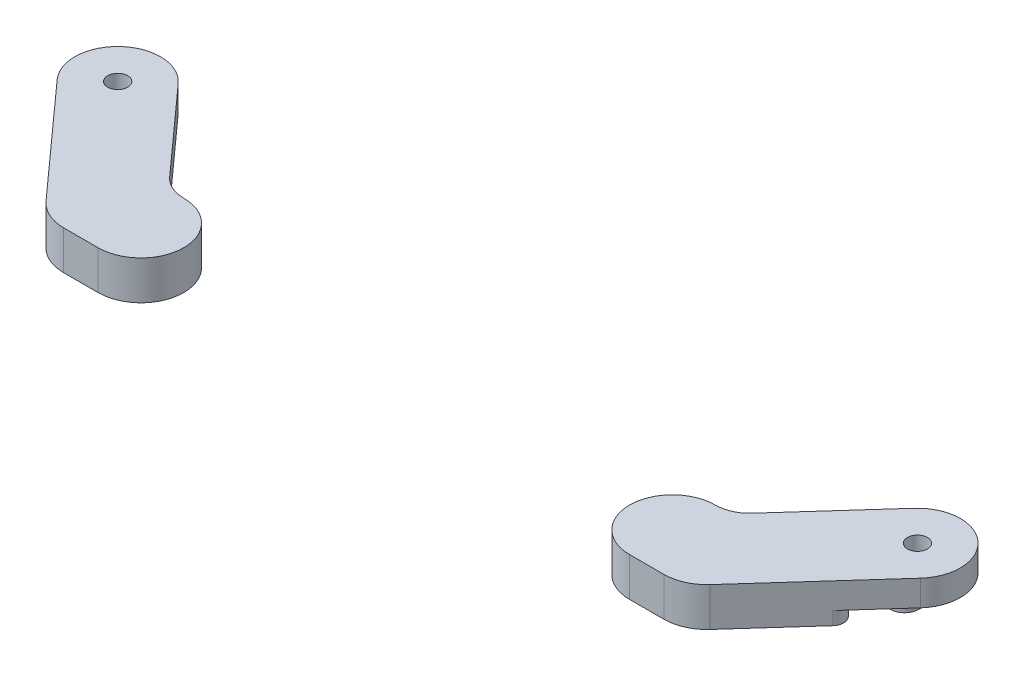
ISO-10303-21;
HEADER;
FILE_DESCRIPTION(('STEP AP214'),'2;1');
FILE_NAME('part.step','',(''),(''),'','','');
FILE_SCHEMA(('AUTOMOTIVE_DESIGN { 1 0 10303 214 1 1 1 1 }'));
ENDSEC;
DATA;
#1=APPLICATION_CONTEXT('core data for automotive mechanical design processes');
#2=APPLICATION_PROTOCOL_DEFINITION('international standard','automotive_design',2000,#1);
#3=PRODUCT_CONTEXT('',#1,'mechanical');
#4=PRODUCT('Part','Part','',(#3));
#5=PRODUCT_RELATED_PRODUCT_CATEGORY('part','',(#4));
#6=PRODUCT_DEFINITION_FORMATION('','',#4);
#7=PRODUCT_DEFINITION_CONTEXT('part definition',#1,'design');
#8=PRODUCT_DEFINITION('design','',#6,#7);
#9=PRODUCT_DEFINITION_SHAPE('','',#8);
#10=(LENGTH_UNIT() NAMED_UNIT(*) SI_UNIT(.MILLI.,.METRE.));
#11=(NAMED_UNIT(*) PLANE_ANGLE_UNIT() SI_UNIT($,.RADIAN.));
#12=(NAMED_UNIT(*) SI_UNIT($,.STERADIAN.) SOLID_ANGLE_UNIT());
#13=UNCERTAINTY_MEASURE_WITH_UNIT(LENGTH_MEASURE(1.E-05),#10,'distance_accuracy_value','');
#14=(GEOMETRIC_REPRESENTATION_CONTEXT(3) GLOBAL_UNCERTAINTY_ASSIGNED_CONTEXT((#13)) GLOBAL_UNIT_ASSIGNED_CONTEXT((#10,
#11,#12)) REPRESENTATION_CONTEXT('',''));
#15=CARTESIAN_POINT('',(0.,0.,0.));
#16=DIRECTION('',(0.,0.,1.));
#17=DIRECTION('',(1.,0.,0.));
#18=AXIS2_PLACEMENT_3D('',#15,#16,#17);
#19=CARTESIAN_POINT('',(92.970606407611,0.,-128.6));
#20=DIRECTION('',(0.,1.,0.));
#21=DIRECTION('',(0.,0.,1.));
#22=AXIS2_PLACEMENT_3D('',#19,#20,#21);
#23=PLANE('',#22);
#24=CARTESIAN_POINT('',(-139.9,0.,-135.9));
#25=DIRECTION('',(0.,-1.,0.));
#26=DIRECTION('',(0.,0.,-1.));
#27=AXIS2_PLACEMENT_3D('',#24,#25,#26);
#28=CIRCLE('',#27,5.00000000000003);
#29=CARTESIAN_POINT('',(-134.9,0.,-135.9));
#30=VERTEX_POINT('',#29);
#31=CARTESIAN_POINT('',(-144.9,0.,-135.9));
#32=VERTEX_POINT('',#31);
#33=EDGE_CURVE('E212',#30,#32,#28,.T.);
#34=ORIENTED_EDGE('',*,*,#33,.F.);
#35=DIRECTION('',(0.,0.,1.));
#36=VECTOR('',#35,1.);
#37=CARTESIAN_POINT('',(-134.9,0.,-135.9));
#38=LINE('',#37,#36);
#39=CARTESIAN_POINT('',(-134.9,0.,-144.9));
#40=VERTEX_POINT('',#39);
#41=EDGE_CURVE('E217',#40,#30,#38,.T.);
#42=ORIENTED_EDGE('',*,*,#41,.F.);
#43=CARTESIAN_POINT('',(-139.9,0.,-144.9));
#44=DIRECTION('',(0.,-1.,0.));
#45=DIRECTION('',(0.,0.,-1.));
#46=AXIS2_PLACEMENT_3D('',#43,#44,#45);
#47=CIRCLE('',#46,5.00000000000003);
#48=CARTESIAN_POINT('',(-144.9,0.,-144.9));
#49=VERTEX_POINT('',#48);
#50=EDGE_CURVE('E229',#49,#40,#47,.T.);
#51=ORIENTED_EDGE('',*,*,#50,.F.);
#52=DIRECTION('',(0.,0.,-1.));
#53=VECTOR('',#52,1.);
#54=CARTESIAN_POINT('',(-144.9,0.,-135.9));
#55=LINE('',#54,#53);
#56=EDGE_CURVE('E226',#32,#49,#55,.T.);
#57=ORIENTED_EDGE('',*,*,#56,.F.);
#58=EDGE_LOOP('',(#34,#42,#51,#57));
#59=FACE_BOUND('',#58,.T.);
#60=CARTESIAN_POINT('',(-133.557307355128,0.,-116.9));
#61=DIRECTION('',(0.,-1.,0.));
#62=DIRECTION('',(0.,0.,1.));
#63=AXIS2_PLACEMENT_3D('',#60,#61,#62);
#64=CIRCLE('',#63,4.);
#65=CARTESIAN_POINT('',(-136.531246063845,0.,-114.224988120252));
#66=VERTEX_POINT('',#65);
#67=CARTESIAN_POINT('',(-133.557307355128,0.,-120.9));
#68=VERTEX_POINT('',#67);
#69=EDGE_CURVE('E197',#66,#68,#64,.T.);
#70=ORIENTED_EDGE('',*,*,#69,.F.);
#71=DIRECTION('',(0.668752969937039,0.,0.743484677179287));
#72=VECTOR('',#71,1.);
#73=CARTESIAN_POINT('',(-151.052270157689,0.,-130.368705450944));
#74=LINE('',#73,#72);
#75=CARTESIAN_POINT('',(-151.052270157689,0.,-130.368705450944));
#76=VERTEX_POINT('',#75);
#77=EDGE_CURVE('E255',#76,#66,#74,.T.);
#78=ORIENTED_EDGE('',*,*,#77,.F.);
#79=CARTESIAN_POINT('',(-139.9,0.,-140.4));
#80=DIRECTION('',(0.,1.,0.));
#81=DIRECTION('',(0.,0.,1.));
#82=AXIS2_PLACEMENT_3D('',#79,#80,#81);
#83=CIRCLE('',#82,15.);
#84=CARTESIAN_POINT('',(-128.747729842311,0.,-150.431294549056));
#85=VERTEX_POINT('',#84);
#86=EDGE_CURVE('E251',#85,#76,#83,.T.);
#87=ORIENTED_EDGE('',*,*,#86,.F.);
#88=DIRECTION('',(-0.66875296993704,0.,-0.743484677179287));
#89=VECTOR('',#88,1.);
#90=CARTESIAN_POINT('',(-128.747729842311,0.,-150.431294549056));
#91=LINE('',#90,#89);
#92=CARTESIAN_POINT('',(-101.892422533762,0.,-120.574964360756));
#93=VERTEX_POINT('',#92);
#94=EDGE_CURVE('E246',#93,#85,#91,.T.);
#95=ORIENTED_EDGE('',*,*,#94,.F.);
#96=CARTESIAN_POINT('',(-92.970606407611,0.,-128.6));
#97=DIRECTION('',(0.,-1.,0.));
#98=DIRECTION('',(0.,0.,-1.));
#99=AXIS2_PLACEMENT_3D('',#96,#97,#98);
#100=CIRCLE('',#99,12.);
#101=CARTESIAN_POINT('',(-101.155921001443,0.,-119.825));
#102=VERTEX_POINT('',#101);
#103=EDGE_CURVE('E247',#102,#93,#100,.T.);
#104=ORIENTED_EDGE('',*,*,#103,.F.);
#105=CARTESIAN_POINT('',(-103.884359199387,0.,-116.9));
#106=DIRECTION('',(0.,-1.,0.));
#107=DIRECTION('',(0.,0.,-1.));
#108=AXIS2_PLACEMENT_3D('',#105,#106,#107);
#109=CIRCLE('',#108,4.);
#110=CARTESIAN_POINT('',(-103.884359199387,0.,-120.9));
#111=VERTEX_POINT('',#110);
#112=EDGE_CURVE('E72',#111,#102,#109,.T.);
#113=ORIENTED_EDGE('',*,*,#112,.F.);
#114=DIRECTION('',(1.,0.,0.));
#115=VECTOR('',#114,1.);
#116=CARTESIAN_POINT('',(-133.557307355128,0.,-120.9));
#117=LINE('',#116,#115);
#118=EDGE_CURVE('E67',#68,#111,#117,.T.);
#119=ORIENTED_EDGE('',*,*,#118,.F.);
#120=EDGE_LOOP('',(#70,#78,#87,#95,#104,#113,#119));
#121=FACE_BOUND('',#120,.T.);
#122=ADVANCED_FACE('F51',(#59,#121),#23,.F.);
#123=CARTESIAN_POINT('',(105.,9.,-86.6000000000001));
#124=DIRECTION('',(0.,0.,-1.));
#125=DIRECTION('',(-1.,0.,0.));
#126=AXIS2_PLACEMENT_3D('',#123,#124,#125);
#127=PLANE('',#126);
#128=DIRECTION('',(0.,1.,0.));
#129=VECTOR('',#128,1.);
#130=CARTESIAN_POINT('',(-92.970606407611,0.,-86.6000000000001));
#131=LINE('',#130,#129);
#132=CARTESIAN_POINT('',(-92.970606407611,-4.6,-86.6000000000001));
#133=VERTEX_POINT('',#132);
#134=CARTESIAN_POINT('',(-92.970606407611,9.,-86.6000000000001));
#135=VERTEX_POINT('',#134);
#136=EDGE_CURVE('E156',#133,#135,#131,.T.);
#137=ORIENTED_EDGE('',*,*,#136,.T.);
#138=DIRECTION('',(1.,0.,0.));
#139=VECTOR('',#138,1.);
#140=CARTESIAN_POINT('',(105.,9.,-86.6000000000001));
#141=LINE('',#140,#139);
#142=CARTESIAN_POINT('',(-105.,9.,-86.6000000000001));
#143=VERTEX_POINT('',#142);
#144=EDGE_CURVE('E55',#143,#135,#141,.T.);
#145=ORIENTED_EDGE('',*,*,#144,.F.);
#146=DIRECTION('',(0.,-1.,0.));
#147=VECTOR('',#146,1.);
#148=CARTESIAN_POINT('',(-105.,9.,-86.6000000000001));
#149=LINE('',#148,#147);
#150=CARTESIAN_POINT('',(-105.,-4.6,-86.6000000000001));
#151=VERTEX_POINT('',#150);
#152=EDGE_CURVE('E165',#143,#151,#149,.T.);
#153=ORIENTED_EDGE('',*,*,#152,.T.);
#154=DIRECTION('',(-1.,0.,0.));
#155=VECTOR('',#154,1.);
#156=CARTESIAN_POINT('',(-92.970606407611,-4.6,-86.6000000000001));
#157=LINE('',#156,#155);
#158=EDGE_CURVE('E169',#133,#151,#157,.T.);
#159=ORIENTED_EDGE('',*,*,#158,.F.);
#160=EDGE_LOOP('',(#137,#145,#153,#159));
#161=FACE_BOUND('',#160,.T.);
#162=ADVANCED_FACE('F53',(#161),#127,.F.);
#163=CARTESIAN_POINT('',(92.970606407611,9.,-128.6));
#164=DIRECTION('',(0.,1.,0.));
#165=DIRECTION('',(0.,0.,1.));
#166=AXIS2_PLACEMENT_3D('',#163,#164,#165);
#167=PLANE('',#166);
#168=CARTESIAN_POINT('',(-139.9,9.,-140.4));
#169=DIRECTION('',(0.,1.,0.));
#170=DIRECTION('',(0.,0.,1.));
#171=AXIS2_PLACEMENT_3D('',#168,#169,#170);
#172=CIRCLE('',#171,3.49999999999999);
#173=CARTESIAN_POINT('',(-139.9,9.,-136.9));
#174=VERTEX_POINT('',#173);
#175=EDGE_CURVE('E183',#174,#174,#172,.T.);
#176=ORIENTED_EDGE('',*,*,#175,.F.);
#177=EDGE_LOOP('',(#176));
#178=FACE_BOUND('',#177,.T.);
#179=CARTESIAN_POINT('',(-92.970606407611,9.,-101.6));
#180=DIRECTION('',(0.,-1.,0.));
#181=DIRECTION('',(0.,0.,1.));
#182=AXIS2_PLACEMENT_3D('',#179,#180,#181);
#183=CIRCLE('',#182,15.);
#184=CARTESIAN_POINT('',(-92.970606407611,9.,-116.6));
#185=VERTEX_POINT('',#184);
#186=EDGE_CURVE('E12',#185,#135,#183,.T.);
#187=ORIENTED_EDGE('',*,*,#186,.F.);
#188=CARTESIAN_POINT('',(-92.970606407611,9.,-128.6));
#189=DIRECTION('',(0.,-1.,0.));
#190=DIRECTION('',(0.,0.,-1.));
#191=AXIS2_PLACEMENT_3D('',#188,#189,#190);
#192=CIRCLE('',#191,12.);
#193=CARTESIAN_POINT('',(-101.892422533762,9.,-120.574964360756));
#194=VERTEX_POINT('',#193);
#195=EDGE_CURVE('E261',#185,#194,#192,.T.);
#196=ORIENTED_EDGE('',*,*,#195,.T.);
#197=DIRECTION('',(-0.66875296993704,0.,-0.743484677179287));
#198=VECTOR('',#197,1.);
#199=CARTESIAN_POINT('',(-128.747729842311,9.,-150.431294549056));
#200=LINE('',#199,#198);
#201=CARTESIAN_POINT('',(-128.747729842311,9.,-150.431294549056));
#202=VERTEX_POINT('',#201);
#203=EDGE_CURVE('E273',#194,#202,#200,.T.);
#204=ORIENTED_EDGE('',*,*,#203,.T.);
#205=CARTESIAN_POINT('',(-139.9,9.,-140.4));
#206=DIRECTION('',(0.,1.,0.));
#207=DIRECTION('',(0.,0.,1.));
#208=AXIS2_PLACEMENT_3D('',#205,#206,#207);
#209=CIRCLE('',#208,15.);
#210=CARTESIAN_POINT('',(-151.052270157689,9.,-130.368705450944));
#211=VERTEX_POINT('',#210);
#212=EDGE_CURVE('E271',#202,#211,#209,.T.);
#213=ORIENTED_EDGE('',*,*,#212,.T.);
#214=DIRECTION('',(0.668752969937039,0.,0.743484677179287));
#215=VECTOR('',#214,1.);
#216=CARTESIAN_POINT('',(-151.052270157689,9.,-130.368705450944));
#217=LINE('',#216,#215);
#218=CARTESIAN_POINT('',(-116.152270157689,9.,-91.5687054509445));
#219=VERTEX_POINT('',#218);
#220=EDGE_CURVE('E269',#211,#219,#217,.T.);
#221=ORIENTED_EDGE('',*,*,#220,.T.);
#222=CARTESIAN_POINT('',(-105.,9.,-101.6));
#223=DIRECTION('',(0.,1.,0.));
#224=DIRECTION('',(0.,0.,1.));
#225=AXIS2_PLACEMENT_3D('',#222,#223,#224);
#226=CIRCLE('',#225,15.);
#227=EDGE_CURVE('E267',#219,#143,#226,.T.);
#228=ORIENTED_EDGE('',*,*,#227,.T.);
#229=ORIENTED_EDGE('',*,*,#144,.T.);
#230=EDGE_LOOP('',(#187,#196,#204,#213,#221,#228,#229));
#231=FACE_BOUND('',#230,.T.);
#232=ADVANCED_FACE('F278',(#178,#231),#167,.T.);
#233=CARTESIAN_POINT('',(-92.970606407611,9.,-128.6));
#234=DIRECTION('',(0.,-1.,0.));
#235=DIRECTION('',(0.,0.,-1.));
#236=AXIS2_PLACEMENT_3D('',#233,#234,#235);
#237=CYLINDRICAL_SURFACE('',#236,12.);
#238=DIRECTION('',(0.,-1.,0.));
#239=VECTOR('',#238,1.);
#240=CARTESIAN_POINT('',(-92.970606407611,9.,-116.6));
#241=LINE('',#240,#239);
#242=CARTESIAN_POINT('',(-92.970606407611,-4.6,-116.6));
#243=VERTEX_POINT('',#242);
#244=EDGE_CURVE('E244',#185,#243,#241,.T.);
#245=ORIENTED_EDGE('',*,*,#244,.T.);
#246=CARTESIAN_POINT('',(-92.970606407611,-4.6,-128.6));
#247=DIRECTION('',(0.,1.,0.));
#248=DIRECTION('',(0.,0.,-1.));
#249=AXIS2_PLACEMENT_3D('',#246,#247,#248);
#250=CIRCLE('',#249,12.);
#251=CARTESIAN_POINT('',(-101.155921001443,-4.6,-119.825));
#252=VERTEX_POINT('',#251);
#253=EDGE_CURVE('E179',#252,#243,#250,.T.);
#254=ORIENTED_EDGE('',*,*,#253,.F.);
#255=DIRECTION('',(0.,1.,0.));
#256=VECTOR('',#255,1.);
#257=CARTESIAN_POINT('',(-101.155921001443,-4.6,-119.825));
#258=LINE('',#257,#256);
#259=EDGE_CURVE('E196',#252,#102,#258,.T.);
#260=ORIENTED_EDGE('',*,*,#259,.T.);
#261=ORIENTED_EDGE('',*,*,#103,.T.);
#262=DIRECTION('',(0.,-1.,0.));
#263=VECTOR('',#262,1.);
#264=CARTESIAN_POINT('',(-101.892422533762,9.,-120.574964360756));
#265=LINE('',#264,#263);
#266=EDGE_CURVE('E248',#194,#93,#265,.T.);
#267=ORIENTED_EDGE('',*,*,#266,.F.);
#268=ORIENTED_EDGE('',*,*,#195,.F.);
#269=EDGE_LOOP('',(#245,#254,#260,#261,#267,#268));
#270=FACE_BOUND('',#269,.T.);
#271=ADVANCED_FACE('F282',(#270),#237,.F.);
#272=CARTESIAN_POINT('',(-128.747729842311,9.,-150.431294549056));
#273=DIRECTION('',(-0.743484677179287,0.,0.66875296993704));
#274=DIRECTION('',(0.66875296993704,0.,0.743484677179287));
#275=AXIS2_PLACEMENT_3D('',#272,#273,#274);
#276=PLANE('',#275);
#277=ORIENTED_EDGE('',*,*,#94,.T.);
#278=DIRECTION('',(0.,-1.,0.));
#279=VECTOR('',#278,1.);
#280=CARTESIAN_POINT('',(-128.747729842311,9.,-150.431294549056));
#281=LINE('',#280,#279);
#282=EDGE_CURVE('E252',#202,#85,#281,.T.);
#283=ORIENTED_EDGE('',*,*,#282,.F.);
#284=ORIENTED_EDGE('',*,*,#203,.F.);
#285=ORIENTED_EDGE('',*,*,#266,.T.);
#286=EDGE_LOOP('',(#277,#283,#284,#285));
#287=FACE_BOUND('',#286,.T.);
#288=ADVANCED_FACE('F285',(#287),#276,.F.);
#289=CARTESIAN_POINT('',(-139.9,9.,-140.4));
#290=DIRECTION('',(0.,-1.,0.));
#291=DIRECTION('',(0.,0.,-1.));
#292=AXIS2_PLACEMENT_3D('',#289,#290,#291);
#293=CYLINDRICAL_SURFACE('',#292,15.);
#294=ORIENTED_EDGE('',*,*,#86,.T.);
#295=DIRECTION('',(0.,-1.,0.));
#296=VECTOR('',#295,1.);
#297=CARTESIAN_POINT('',(-151.052270157689,9.,-130.368705450944));
#298=LINE('',#297,#296);
#299=EDGE_CURVE('E256',#211,#76,#298,.T.);
#300=ORIENTED_EDGE('',*,*,#299,.F.);
#301=ORIENTED_EDGE('',*,*,#212,.F.);
#302=ORIENTED_EDGE('',*,*,#282,.T.);
#303=EDGE_LOOP('',(#294,#300,#301,#302));
#304=FACE_BOUND('',#303,.T.);
#305=ADVANCED_FACE('F290',(#304),#293,.T.);
#306=CARTESIAN_POINT('',(-151.052270157689,9.,-130.368705450944));
#307=DIRECTION('',(0.743484677179287,0.,-0.668752969937039));
#308=DIRECTION('',(-0.668752969937039,0.,-0.743484677179287));
#309=AXIS2_PLACEMENT_3D('',#306,#307,#308);
#310=PLANE('',#309);
#311=ORIENTED_EDGE('',*,*,#77,.T.);
#312=DIRECTION('',(0.,1.,0.));
#313=VECTOR('',#312,1.);
#314=CARTESIAN_POINT('',(-136.531246063845,-4.6,-114.224988120252));
#315=LINE('',#314,#313);
#316=CARTESIAN_POINT('',(-136.531246063845,-4.6,-114.224988120252));
#317=VERTEX_POINT('',#316);
#318=EDGE_CURVE('E209',#317,#66,#315,.T.);
#319=ORIENTED_EDGE('',*,*,#318,.F.);
#320=DIRECTION('',(-0.668752969937039,0.,-0.743484677179287));
#321=VECTOR('',#320,1.);
#322=CARTESIAN_POINT('',(-116.152270157689,-4.6,-91.5687054509445));
#323=LINE('',#322,#321);
#324=CARTESIAN_POINT('',(-116.152270157689,-4.6,-91.5687054509445));
#325=VERTEX_POINT('',#324);
#326=EDGE_CURVE('E187',#325,#317,#323,.T.);
#327=ORIENTED_EDGE('',*,*,#326,.F.);
#328=DIRECTION('',(0.,-1.,0.));
#329=VECTOR('',#328,1.);
#330=CARTESIAN_POINT('',(-116.152270157689,9.,-91.5687054509445));
#331=LINE('',#330,#329);
#332=EDGE_CURVE('E60',#219,#325,#331,.T.);
#333=ORIENTED_EDGE('',*,*,#332,.F.);
#334=ORIENTED_EDGE('',*,*,#220,.F.);
#335=ORIENTED_EDGE('',*,*,#299,.T.);
#336=EDGE_LOOP('',(#311,#319,#327,#333,#334,#335));
#337=FACE_BOUND('',#336,.T.);
#338=ADVANCED_FACE('F296',(#337),#310,.F.);
#339=CARTESIAN_POINT('',(-105.,9.,-101.6));
#340=DIRECTION('',(0.,-1.,0.));
#341=DIRECTION('',(0.,0.,-1.));
#342=AXIS2_PLACEMENT_3D('',#339,#340,#341);
#343=CYLINDRICAL_SURFACE('',#342,15.);
#344=ORIENTED_EDGE('',*,*,#332,.T.);
#345=CARTESIAN_POINT('',(-105.,-4.6,-101.6));
#346=DIRECTION('',(0.,-1.,0.));
#347=DIRECTION('',(0.,0.,-1.));
#348=AXIS2_PLACEMENT_3D('',#345,#346,#347);
#349=CIRCLE('',#348,15.);
#350=EDGE_CURVE('E174',#151,#325,#349,.T.);
#351=ORIENTED_EDGE('',*,*,#350,.F.);
#352=ORIENTED_EDGE('',*,*,#152,.F.);
#353=ORIENTED_EDGE('',*,*,#227,.F.);
#354=EDGE_LOOP('',(#344,#351,#352,#353));
#355=FACE_BOUND('',#354,.T.);
#356=ADVANCED_FACE('F299',(#355),#343,.T.);
#357=CARTESIAN_POINT('',(-92.970606407611,0.,-101.6));
#358=DIRECTION('',(0.,1.,0.));
#359=DIRECTION('',(0.,0.,1.));
#360=AXIS2_PLACEMENT_3D('',#357,#358,#359);
#361=CYLINDRICAL_SURFACE('',#360,15.);
#362=ORIENTED_EDGE('',*,*,#186,.T.);
#363=ORIENTED_EDGE('',*,*,#136,.F.);
#364=CARTESIAN_POINT('',(-92.970606407611,-4.6,-101.6));
#365=DIRECTION('',(0.,-1.,0.));
#366=DIRECTION('',(0.,0.,-1.));
#367=AXIS2_PLACEMENT_3D('',#364,#365,#366);
#368=CIRCLE('',#367,15.);
#369=EDGE_CURVE('E160',#243,#133,#368,.T.);
#370=ORIENTED_EDGE('',*,*,#369,.F.);
#371=ORIENTED_EDGE('',*,*,#244,.F.);
#372=EDGE_LOOP('',(#362,#363,#370,#371));
#373=FACE_BOUND('',#372,.T.);
#374=ADVANCED_FACE('F158',(#373),#361,.T.);
#375=CARTESIAN_POINT('',(-139.9,-6.3,-135.9));
#376=DIRECTION('',(0.,1.,0.));
#377=DIRECTION('',(0.,0.,1.));
#378=AXIS2_PLACEMENT_3D('',#375,#376,#377);
#379=CYLINDRICAL_SURFACE('',#378,5.00000000000003);
#380=ORIENTED_EDGE('',*,*,#33,.T.);
#381=DIRECTION('',(0.,1.,0.));
#382=VECTOR('',#381,1.);
#383=CARTESIAN_POINT('',(-144.9,-6.3,-135.9));
#384=LINE('',#383,#382);
#385=CARTESIAN_POINT('',(-144.9,-6.3,-135.9));
#386=VERTEX_POINT('',#385);
#387=EDGE_CURVE('E166',#386,#32,#384,.T.);
#388=ORIENTED_EDGE('',*,*,#387,.F.);
#389=CARTESIAN_POINT('',(-139.9,-6.3,-135.9));
#390=DIRECTION('',(0.,-1.,0.));
#391=DIRECTION('',(0.,0.,-1.));
#392=AXIS2_PLACEMENT_3D('',#389,#390,#391);
#393=CIRCLE('',#392,5.00000000000003);
#394=CARTESIAN_POINT('',(-134.9,-6.3,-135.9));
#395=VERTEX_POINT('',#394);
#396=EDGE_CURVE('E213',#395,#386,#393,.T.);
#397=ORIENTED_EDGE('',*,*,#396,.F.);
#398=DIRECTION('',(0.,1.,0.));
#399=VECTOR('',#398,1.);
#400=CARTESIAN_POINT('',(-134.9,-6.3,-135.9));
#401=LINE('',#400,#399);
#402=EDGE_CURVE('E223',#395,#30,#401,.T.);
#403=ORIENTED_EDGE('',*,*,#402,.T.);
#404=EDGE_LOOP('',(#380,#388,#397,#403));
#405=FACE_BOUND('',#404,.T.);
#406=ADVANCED_FACE('F380',(#405),#379,.T.);
#407=CARTESIAN_POINT('',(-144.9,-6.3,-135.9));
#408=DIRECTION('',(1.,0.,0.));
#409=DIRECTION('',(0.,0.,-1.));
#410=AXIS2_PLACEMENT_3D('',#407,#408,#409);
#411=PLANE('',#410);
#412=ORIENTED_EDGE('',*,*,#56,.T.);
#413=DIRECTION('',(0.,1.,0.));
#414=VECTOR('',#413,1.);
#415=CARTESIAN_POINT('',(-144.9,-6.3,-144.9));
#416=LINE('',#415,#414);
#417=CARTESIAN_POINT('',(-144.9,-6.3,-144.9));
#418=VERTEX_POINT('',#417);
#419=EDGE_CURVE('E239',#418,#49,#416,.T.);
#420=ORIENTED_EDGE('',*,*,#419,.F.);
#421=DIRECTION('',(0.,0.,-1.));
#422=VECTOR('',#421,1.);
#423=CARTESIAN_POINT('',(-144.9,-6.3,-135.9));
#424=LINE('',#423,#422);
#425=EDGE_CURVE('E216',#386,#418,#424,.T.);
#426=ORIENTED_EDGE('',*,*,#425,.F.);
#427=ORIENTED_EDGE('',*,*,#387,.T.);
#428=EDGE_LOOP('',(#412,#420,#426,#427));
#429=FACE_BOUND('',#428,.T.);
#430=ADVANCED_FACE('F439',(#429),#411,.F.);
#431=CARTESIAN_POINT('',(-139.9,-6.3,-144.9));
#432=DIRECTION('',(0.,1.,0.));
#433=DIRECTION('',(0.,0.,1.));
#434=AXIS2_PLACEMENT_3D('',#431,#432,#433);
#435=CYLINDRICAL_SURFACE('',#434,5.00000000000003);
#436=ORIENTED_EDGE('',*,*,#50,.T.);
#437=DIRECTION('',(0.,1.,0.));
#438=VECTOR('',#437,1.);
#439=CARTESIAN_POINT('',(-134.9,-6.3,-144.9));
#440=LINE('',#439,#438);
#441=CARTESIAN_POINT('',(-134.9,-6.3,-144.9));
#442=VERTEX_POINT('',#441);
#443=EDGE_CURVE('E236',#442,#40,#440,.T.);
#444=ORIENTED_EDGE('',*,*,#443,.F.);
#445=CARTESIAN_POINT('',(-139.9,-6.3,-144.9));
#446=DIRECTION('',(0.,-1.,0.));
#447=DIRECTION('',(0.,0.,-1.));
#448=AXIS2_PLACEMENT_3D('',#445,#446,#447);
#449=CIRCLE('',#448,5.00000000000003);
#450=EDGE_CURVE('E219',#418,#442,#449,.T.);
#451=ORIENTED_EDGE('',*,*,#450,.F.);
#452=ORIENTED_EDGE('',*,*,#419,.T.);
#453=EDGE_LOOP('',(#436,#444,#451,#452));
#454=FACE_BOUND('',#453,.T.);
#455=ADVANCED_FACE('F431',(#454),#435,.T.);
#456=CARTESIAN_POINT('',(-134.9,-6.3,-135.9));
#457=DIRECTION('',(-1.,0.,0.));
#458=DIRECTION('',(0.,0.,1.));
#459=AXIS2_PLACEMENT_3D('',#456,#457,#458);
#460=PLANE('',#459);
#461=ORIENTED_EDGE('',*,*,#41,.T.);
#462=ORIENTED_EDGE('',*,*,#402,.F.);
#463=DIRECTION('',(0.,0.,1.));
#464=VECTOR('',#463,1.);
#465=CARTESIAN_POINT('',(-134.9,-6.3,-135.9));
#466=LINE('',#465,#464);
#467=EDGE_CURVE('E221',#442,#395,#466,.T.);
#468=ORIENTED_EDGE('',*,*,#467,.F.);
#469=ORIENTED_EDGE('',*,*,#443,.T.);
#470=EDGE_LOOP('',(#461,#462,#468,#469));
#471=FACE_BOUND('',#470,.T.);
#472=ADVANCED_FACE('F423',(#471),#460,.F.);
#473=CARTESIAN_POINT('',(-139.9,-6.3,-135.9));
#474=DIRECTION('',(0.,-1.,0.));
#475=DIRECTION('',(0.,0.,-1.));
#476=AXIS2_PLACEMENT_3D('',#473,#474,#475);
#477=PLANE('',#476);
#478=ORIENTED_EDGE('',*,*,#396,.T.);
#479=ORIENTED_EDGE('',*,*,#425,.T.);
#480=ORIENTED_EDGE('',*,*,#450,.T.);
#481=ORIENTED_EDGE('',*,*,#467,.T.);
#482=EDGE_LOOP('',(#478,#479,#480,#481));
#483=FACE_BOUND('',#482,.T.);
#484=ADVANCED_FACE('F372',(#483),#477,.T.);
#485=CARTESIAN_POINT('',(-133.557307355128,-4.6,-116.9));
#486=DIRECTION('',(0.,1.,0.));
#487=DIRECTION('',(0.,0.,1.));
#488=AXIS2_PLACEMENT_3D('',#485,#486,#487);
#489=CYLINDRICAL_SURFACE('',#488,4.);
#490=ORIENTED_EDGE('',*,*,#69,.T.);
#491=DIRECTION('',(0.,1.,0.));
#492=VECTOR('',#491,1.);
#493=CARTESIAN_POINT('',(-133.557307355128,-4.6,-120.9));
#494=LINE('',#493,#492);
#495=CARTESIAN_POINT('',(-133.557307355128,-4.6,-120.9));
#496=VERTEX_POINT('',#495);
#497=EDGE_CURVE('E206',#496,#68,#494,.T.);
#498=ORIENTED_EDGE('',*,*,#497,.F.);
#499=CARTESIAN_POINT('',(-133.557307355128,-4.6,-116.9));
#500=DIRECTION('',(0.,-1.,0.));
#501=DIRECTION('',(0.,0.,1.));
#502=AXIS2_PLACEMENT_3D('',#499,#500,#501);
#503=CIRCLE('',#502,4.);
#504=EDGE_CURVE('E189',#317,#496,#503,.T.);
#505=ORIENTED_EDGE('',*,*,#504,.F.);
#506=ORIENTED_EDGE('',*,*,#318,.T.);
#507=EDGE_LOOP('',(#490,#498,#505,#506));
#508=FACE_BOUND('',#507,.T.);
#509=ADVANCED_FACE('F304',(#508),#489,.T.);
#510=CARTESIAN_POINT('',(-133.557307355128,-4.6,-120.9));
#511=DIRECTION('',(0.,0.,1.));
#512=DIRECTION('',(1.,0.,0.));
#513=AXIS2_PLACEMENT_3D('',#510,#511,#512);
#514=PLANE('',#513);
#515=ORIENTED_EDGE('',*,*,#118,.T.);
#516=DIRECTION('',(0.,1.,0.));
#517=VECTOR('',#516,1.);
#518=CARTESIAN_POINT('',(-103.884359199387,-4.6,-120.9));
#519=LINE('',#518,#517);
#520=CARTESIAN_POINT('',(-103.884359199387,-4.6,-120.9));
#521=VERTEX_POINT('',#520);
#522=EDGE_CURVE('E203',#521,#111,#519,.T.);
#523=ORIENTED_EDGE('',*,*,#522,.F.);
#524=DIRECTION('',(1.,0.,0.));
#525=VECTOR('',#524,1.);
#526=CARTESIAN_POINT('',(-133.557307355128,-4.6,-120.9));
#527=LINE('',#526,#525);
#528=EDGE_CURVE('E191',#496,#521,#527,.T.);
#529=ORIENTED_EDGE('',*,*,#528,.F.);
#530=ORIENTED_EDGE('',*,*,#497,.T.);
#531=EDGE_LOOP('',(#515,#523,#529,#530));
#532=FACE_BOUND('',#531,.T.);
#533=ADVANCED_FACE('F308',(#532),#514,.F.);
#534=CARTESIAN_POINT('',(-103.884359199387,-4.6,-116.9));
#535=DIRECTION('',(0.,1.,0.));
#536=DIRECTION('',(0.,0.,1.));
#537=AXIS2_PLACEMENT_3D('',#534,#535,#536);
#538=CYLINDRICAL_SURFACE('',#537,4.);
#539=ORIENTED_EDGE('',*,*,#112,.T.);
#540=ORIENTED_EDGE('',*,*,#259,.F.);
#541=CARTESIAN_POINT('',(-103.884359199387,-4.6,-116.9));
#542=DIRECTION('',(0.,-1.,0.));
#543=DIRECTION('',(0.,0.,-1.));
#544=AXIS2_PLACEMENT_3D('',#541,#542,#543);
#545=CIRCLE('',#544,4.);
#546=EDGE_CURVE('E193',#521,#252,#545,.T.);
#547=ORIENTED_EDGE('',*,*,#546,.F.);
#548=ORIENTED_EDGE('',*,*,#522,.T.);
#549=EDGE_LOOP('',(#539,#540,#547,#548));
#550=FACE_BOUND('',#549,.T.);
#551=ADVANCED_FACE('F312',(#550),#538,.T.);
#552=CARTESIAN_POINT('',(-92.970606407611,-4.6,-101.6));
#553=DIRECTION('',(0.,-1.,0.));
#554=DIRECTION('',(0.,0.,-1.));
#555=AXIS2_PLACEMENT_3D('',#552,#553,#554);
#556=PLANE('',#555);
#557=ORIENTED_EDGE('',*,*,#369,.T.);
#558=ORIENTED_EDGE('',*,*,#158,.T.);
#559=ORIENTED_EDGE('',*,*,#350,.T.);
#560=ORIENTED_EDGE('',*,*,#326,.T.);
#561=ORIENTED_EDGE('',*,*,#504,.T.);
#562=ORIENTED_EDGE('',*,*,#528,.T.);
#563=ORIENTED_EDGE('',*,*,#546,.T.);
#564=ORIENTED_EDGE('',*,*,#253,.T.);
#565=EDGE_LOOP('',(#557,#558,#559,#560,#561,#562,#563,#564));
#566=FACE_BOUND('',#565,.T.);
#567=ADVANCED_FACE('F177',(#566),#556,.T.);
#568=CARTESIAN_POINT('',(-139.9,0.,-140.4));
#569=DIRECTION('',(0.,1.,0.));
#570=DIRECTION('',(0.,0.,1.));
#571=AXIS2_PLACEMENT_3D('',#568,#569,#570);
#572=CYLINDRICAL_SURFACE('',#571,3.49999999999999);
#573=CARTESIAN_POINT('',(-139.9,0.,-140.4));
#574=DIRECTION('',(0.,1.,0.));
#575=DIRECTION('',(0.,0.,1.));
#576=AXIS2_PLACEMENT_3D('',#573,#574,#575);
#577=CIRCLE('',#576,3.49999999999999);
#578=CARTESIAN_POINT('',(-139.9,0.,-136.9));
#579=VERTEX_POINT('',#578);
#580=EDGE_CURVE('E199',#579,#579,#577,.T.);
#581=ORIENTED_EDGE('',*,*,#580,.F.);
#582=EDGE_LOOP('',(#581));
#583=FACE_BOUND('',#582,.T.);
#584=ORIENTED_EDGE('',*,*,#175,.T.);
#585=EDGE_LOOP('',(#584));
#586=FACE_BOUND('',#585,.T.);
#587=ADVANCED_FACE('F319',(#583,#586),#572,.F.);
#588=CARTESIAN_POINT('',(-139.9,0.,-140.4));
#589=DIRECTION('',(0.,1.,0.));
#590=DIRECTION('',(0.,0.,1.));
#591=AXIS2_PLACEMENT_3D('',#588,#589,#590);
#592=PLANE('',#591);
#593=ORIENTED_EDGE('',*,*,#580,.T.);
#594=EDGE_LOOP('',(#593));
#595=FACE_BOUND('',#594,.T.);
#596=ADVANCED_FACE('F344',(#595),#592,.T.);
#597=CLOSED_SHELL('',(#122,#162,#232,#271,#288,#305,#338,#356,#374,#406,#430,#455,#472,#484,
#509,#533,#551,#567,#587,#596));
#598=MANIFOLD_SOLID_BREP('B2',#597);
#599=CARTESIAN_POINT('',(92.970606407611,0.,-128.6));
#600=DIRECTION('',(0.,1.,0.));
#601=DIRECTION('',(0.,0.,1.));
#602=AXIS2_PLACEMENT_3D('',#599,#600,#601);
#603=PLANE('',#602);
#604=CARTESIAN_POINT('',(139.9,0.,-135.9));
#605=DIRECTION('',(0.,-1.,0.));
#606=DIRECTION('',(0.,0.,-1.));
#607=AXIS2_PLACEMENT_3D('',#604,#605,#606);
#608=CIRCLE('',#607,5.);
#609=CARTESIAN_POINT('',(144.9,0.,-135.9));
#610=VERTEX_POINT('',#609);
#611=CARTESIAN_POINT('',(134.9,0.,-135.9));
#612=VERTEX_POINT('',#611);
#613=EDGE_CURVE('E636',#610,#612,#608,.T.);
#614=ORIENTED_EDGE('',*,*,#613,.F.);
#615=DIRECTION('',(0.,0.,1.));
#616=VECTOR('',#615,1.);
#617=CARTESIAN_POINT('',(144.9,0.,-135.9));
#618=LINE('',#617,#616);
#619=CARTESIAN_POINT('',(144.9,0.,-144.9));
#620=VERTEX_POINT('',#619);
#621=EDGE_CURVE('E641',#620,#610,#618,.T.);
#622=ORIENTED_EDGE('',*,*,#621,.F.);
#623=CARTESIAN_POINT('',(139.9,0.,-144.9));
#624=DIRECTION('',(0.,-1.,0.));
#625=DIRECTION('',(0.,0.,-1.));
#626=AXIS2_PLACEMENT_3D('',#623,#624,#625);
#627=CIRCLE('',#626,5.);
#628=CARTESIAN_POINT('',(134.9,0.,-144.9));
#629=VERTEX_POINT('',#628);
#630=EDGE_CURVE('E653',#629,#620,#627,.T.);
#631=ORIENTED_EDGE('',*,*,#630,.F.);
#632=DIRECTION('',(0.,0.,-1.));
#633=VECTOR('',#632,1.);
#634=CARTESIAN_POINT('',(134.9,0.,-135.9));
#635=LINE('',#634,#633);
#636=EDGE_CURVE('E650',#612,#629,#635,.T.);
#637=ORIENTED_EDGE('',*,*,#636,.F.);
#638=EDGE_LOOP('',(#614,#622,#631,#637));
#639=FACE_BOUND('',#638,.T.);
#640=CARTESIAN_POINT('',(103.884359199387,0.,-116.9));
#641=DIRECTION('',(0.,-1.,0.));
#642=DIRECTION('',(0.,0.,1.));
#643=AXIS2_PLACEMENT_3D('',#640,#641,#642);
#644=CIRCLE('',#643,4.00000000000001);
#645=CARTESIAN_POINT('',(101.155921001443,0.,-119.825));
#646=VERTEX_POINT('',#645);
#647=CARTESIAN_POINT('',(103.884359199387,0.,-120.9));
#648=VERTEX_POINT('',#647);
#649=EDGE_CURVE('E621',#646,#648,#644,.T.);
#650=ORIENTED_EDGE('',*,*,#649,.F.);
#651=CARTESIAN_POINT('',(92.970606407611,0.,-128.6));
#652=DIRECTION('',(0.,-1.,0.));
#653=DIRECTION('',(0.,0.,1.));
#654=AXIS2_PLACEMENT_3D('',#651,#652,#653);
#655=CIRCLE('',#654,12.);
#656=CARTESIAN_POINT('',(101.892422533762,0.,-120.574964360756));
#657=VERTEX_POINT('',#656);
#658=EDGE_CURVE('E672',#657,#646,#655,.T.);
#659=ORIENTED_EDGE('',*,*,#658,.F.);
#660=DIRECTION('',(-0.66875296993704,0.,0.743484677179286));
#661=VECTOR('',#660,1.);
#662=CARTESIAN_POINT('',(101.892422533762,0.,-120.574964360756));
#663=LINE('',#662,#661);
#664=CARTESIAN_POINT('',(128.747729842311,0.,-150.431294549056));
#665=VERTEX_POINT('',#664);
#666=EDGE_CURVE('E677',#665,#657,#663,.T.);
#667=ORIENTED_EDGE('',*,*,#666,.F.);
#668=CARTESIAN_POINT('',(139.9,0.,-140.4));
#669=DIRECTION('',(0.,1.,0.));
#670=DIRECTION('',(0.,0.,1.));
#671=AXIS2_PLACEMENT_3D('',#668,#669,#670);
#672=CIRCLE('',#671,15.);
#673=CARTESIAN_POINT('',(151.052270157689,0.,-130.368705450944));
#674=VERTEX_POINT('',#673);
#675=EDGE_CURVE('E691',#674,#665,#672,.T.);
#676=ORIENTED_EDGE('',*,*,#675,.F.);
#677=DIRECTION('',(0.66875296993704,0.,-0.743484677179287));
#678=VECTOR('',#677,1.);
#679=CARTESIAN_POINT('',(116.152270157689,0.,-91.5687054509444));
#680=LINE('',#679,#678);
#681=CARTESIAN_POINT('',(136.531246063845,0.,-114.224988120252));
#682=VERTEX_POINT('',#681);
#683=EDGE_CURVE('E689',#682,#674,#680,.T.);
#684=ORIENTED_EDGE('',*,*,#683,.F.);
#685=CARTESIAN_POINT('',(133.557307355128,0.,-116.9));
#686=DIRECTION('',(0.,-1.,0.));
#687=DIRECTION('',(0.,0.,-1.));
#688=AXIS2_PLACEMENT_3D('',#685,#686,#687);
#689=CIRCLE('',#688,4.00000000000001);
#690=CARTESIAN_POINT('',(133.557307355128,0.,-120.9));
#691=VERTEX_POINT('',#690);
#692=EDGE_CURVE('E497',#691,#682,#689,.T.);
#693=ORIENTED_EDGE('',*,*,#692,.F.);
#694=DIRECTION('',(1.,0.,0.));
#695=VECTOR('',#694,1.);
#696=CARTESIAN_POINT('',(103.884359199387,0.,-120.9));
#697=LINE('',#696,#695);
#698=EDGE_CURVE('E492',#648,#691,#697,.T.);
#699=ORIENTED_EDGE('',*,*,#698,.F.);
#700=EDGE_LOOP('',(#650,#659,#667,#676,#684,#693,#699));
#701=FACE_BOUND('',#700,.T.);
#702=ADVANCED_FACE('F477',(#639,#701),#603,.F.);
#703=CARTESIAN_POINT('',(105.,9.,-101.6));
#704=DIRECTION('',(0.,-1.,0.));
#705=DIRECTION('',(0.,0.,-1.));
#706=AXIS2_PLACEMENT_3D('',#703,#704,#705);
#707=CYLINDRICAL_SURFACE('',#706,15.);
#708=DIRECTION('',(0.,-1.,0.));
#709=VECTOR('',#708,1.);
#710=CARTESIAN_POINT('',(105.,9.,-86.6000000000001));
#711=LINE('',#710,#709);
#712=CARTESIAN_POINT('',(105.,9.,-86.6000000000001));
#713=VERTEX_POINT('',#712);
#714=CARTESIAN_POINT('',(105.,-4.6,-86.6000000000001));
#715=VERTEX_POINT('',#714);
#716=EDGE_CURVE('E485',#713,#715,#711,.T.);
#717=ORIENTED_EDGE('',*,*,#716,.T.);
#718=CARTESIAN_POINT('',(105.,-4.6,-101.6));
#719=DIRECTION('',(0.,-1.,0.));
#720=DIRECTION('',(0.,0.,-1.));
#721=AXIS2_PLACEMENT_3D('',#718,#719,#720);
#722=CIRCLE('',#721,15.);
#723=CARTESIAN_POINT('',(116.152270157689,-4.6,-91.5687054509444));
#724=VERTEX_POINT('',#723);
#725=EDGE_CURVE('E586',#724,#715,#722,.T.);
#726=ORIENTED_EDGE('',*,*,#725,.F.);
#727=DIRECTION('',(0.,-1.,0.));
#728=VECTOR('',#727,1.);
#729=CARTESIAN_POINT('',(116.152270157689,9.,-91.5687054509444));
#730=LINE('',#729,#728);
#731=CARTESIAN_POINT('',(116.152270157689,9.,-91.5687054509444));
#732=VERTEX_POINT('',#731);
#733=EDGE_CURVE('E590',#732,#724,#730,.T.);
#734=ORIENTED_EDGE('',*,*,#733,.F.);
#735=CARTESIAN_POINT('',(105.,9.,-101.6));
#736=DIRECTION('',(0.,1.,0.));
#737=DIRECTION('',(0.,0.,1.));
#738=AXIS2_PLACEMENT_3D('',#735,#736,#737);
#739=CIRCLE('',#738,15.);
#740=EDGE_CURVE('E587',#713,#732,#739,.T.);
#741=ORIENTED_EDGE('',*,*,#740,.F.);
#742=EDGE_LOOP('',(#717,#726,#734,#741));
#743=FACE_BOUND('',#742,.T.);
#744=ADVANCED_FACE('F583',(#743),#707,.T.);
#745=CARTESIAN_POINT('',(116.152270157689,9.,-91.5687054509444));
#746=DIRECTION('',(-0.743484677179287,0.,-0.66875296993704));
#747=DIRECTION('',(-0.66875296993704,0.,0.743484677179287));
#748=AXIS2_PLACEMENT_3D('',#745,#746,#747);
#749=PLANE('',#748);
#750=ORIENTED_EDGE('',*,*,#733,.T.);
#751=DIRECTION('',(-0.66875296993704,0.,0.743484677179287));
#752=VECTOR('',#751,1.);
#753=CARTESIAN_POINT('',(136.531246063845,-4.6,-114.224988120252));
#754=LINE('',#753,#752);
#755=CARTESIAN_POINT('',(136.531246063845,-4.6,-114.224988120252));
#756=VERTEX_POINT('',#755);
#757=EDGE_CURVE('E603',#756,#724,#754,.T.);
#758=ORIENTED_EDGE('',*,*,#757,.F.);
#759=DIRECTION('',(0.,1.,0.));
#760=VECTOR('',#759,1.);
#761=CARTESIAN_POINT('',(136.531246063845,-4.6,-114.224988120252));
#762=LINE('',#761,#760);
#763=EDGE_CURVE('E620',#756,#682,#762,.T.);
#764=ORIENTED_EDGE('',*,*,#763,.T.);
#765=ORIENTED_EDGE('',*,*,#683,.T.);
#766=DIRECTION('',(0.,-1.,0.));
#767=VECTOR('',#766,1.);
#768=CARTESIAN_POINT('',(151.052270157689,9.,-130.368705450944));
#769=LINE('',#768,#767);
#770=CARTESIAN_POINT('',(151.052270157689,9.,-130.368705450944));
#771=VERTEX_POINT('',#770);
#772=EDGE_CURVE('E699',#771,#674,#769,.T.);
#773=ORIENTED_EDGE('',*,*,#772,.F.);
#774=DIRECTION('',(0.66875296993704,0.,-0.743484677179287));
#775=VECTOR('',#774,1.);
#776=CARTESIAN_POINT('',(116.152270157689,9.,-91.5687054509444));
#777=LINE('',#776,#775);
#778=EDGE_CURVE('E680',#732,#771,#777,.T.);
#779=ORIENTED_EDGE('',*,*,#778,.F.);
#780=EDGE_LOOP('',(#750,#758,#764,#765,#773,#779));
#781=FACE_BOUND('',#780,.T.);
#782=ADVANCED_FACE('F704',(#781),#749,.F.);
#783=CARTESIAN_POINT('',(139.9,9.,-140.4));
#784=DIRECTION('',(0.,-1.,0.));
#785=DIRECTION('',(0.,0.,-1.));
#786=AXIS2_PLACEMENT_3D('',#783,#784,#785);
#787=CYLINDRICAL_SURFACE('',#786,15.);
#788=ORIENTED_EDGE('',*,*,#675,.T.);
#789=DIRECTION('',(0.,-1.,0.));
#790=VECTOR('',#789,1.);
#791=CARTESIAN_POINT('',(128.747729842311,9.,-150.431294549056));
#792=LINE('',#791,#790);
#793=CARTESIAN_POINT('',(128.747729842311,9.,-150.431294549056));
#794=VERTEX_POINT('',#793);
#795=EDGE_CURVE('E696',#794,#665,#792,.T.);
#796=ORIENTED_EDGE('',*,*,#795,.F.);
#797=CARTESIAN_POINT('',(139.9,9.,-140.4));
#798=DIRECTION('',(0.,1.,0.));
#799=DIRECTION('',(0.,0.,1.));
#800=AXIS2_PLACEMENT_3D('',#797,#798,#799);
#801=CIRCLE('',#800,15.);
#802=EDGE_CURVE('E682',#771,#794,#801,.T.);
#803=ORIENTED_EDGE('',*,*,#802,.F.);
#804=ORIENTED_EDGE('',*,*,#772,.T.);
#805=EDGE_LOOP('',(#788,#796,#803,#804));
#806=FACE_BOUND('',#805,.T.);
#807=ADVANCED_FACE('F733',(#806),#787,.T.);
#808=CARTESIAN_POINT('',(101.892422533762,9.,-120.574964360756));
#809=DIRECTION('',(0.743484677179286,0.,0.66875296993704));
#810=DIRECTION('',(0.66875296993704,0.,-0.743484677179286));
#811=AXIS2_PLACEMENT_3D('',#808,#809,#810);
#812=PLANE('',#811);
#813=ORIENTED_EDGE('',*,*,#666,.T.);
#814=DIRECTION('',(0.,-1.,0.));
#815=VECTOR('',#814,1.);
#816=CARTESIAN_POINT('',(101.892422533762,9.,-120.574964360756));
#817=LINE('',#816,#815);
#818=CARTESIAN_POINT('',(101.892422533762,9.,-120.574964360756));
#819=VERTEX_POINT('',#818);
#820=EDGE_CURVE('E686',#819,#657,#817,.T.);
#821=ORIENTED_EDGE('',*,*,#820,.F.);
#822=DIRECTION('',(-0.66875296993704,0.,0.743484677179286));
#823=VECTOR('',#822,1.);
#824=CARTESIAN_POINT('',(101.892422533762,9.,-120.574964360756));
#825=LINE('',#824,#823);
#826=EDGE_CURVE('E684',#794,#819,#825,.T.);
#827=ORIENTED_EDGE('',*,*,#826,.F.);
#828=ORIENTED_EDGE('',*,*,#795,.T.);
#829=EDGE_LOOP('',(#813,#821,#827,#828));
#830=FACE_BOUND('',#829,.T.);
#831=ADVANCED_FACE('F737',(#830),#812,.F.);
#832=CARTESIAN_POINT('',(92.970606407611,9.,-128.6));
#833=DIRECTION('',(0.,1.,0.));
#834=DIRECTION('',(0.,0.,1.));
#835=AXIS2_PLACEMENT_3D('',#832,#833,#834);
#836=PLANE('',#835);
#837=CARTESIAN_POINT('',(139.9,9.,-140.4));
#838=DIRECTION('',(0.,1.,0.));
#839=DIRECTION('',(0.,0.,1.));
#840=AXIS2_PLACEMENT_3D('',#837,#838,#839);
#841=CIRCLE('',#840,3.49999999999999);
#842=CARTESIAN_POINT('',(139.9,9.,-136.9));
#843=VERTEX_POINT('',#842);
#844=EDGE_CURVE('E607',#843,#843,#841,.T.);
#845=ORIENTED_EDGE('',*,*,#844,.F.);
#846=EDGE_LOOP('',(#845));
#847=FACE_BOUND('',#846,.T.);
#848=CARTESIAN_POINT('',(92.970606407611,9.,-101.6));
#849=DIRECTION('',(0.,-1.,0.));
#850=DIRECTION('',(0.,0.,1.));
#851=AXIS2_PLACEMENT_3D('',#848,#849,#850);
#852=CIRCLE('',#851,15.);
#853=CARTESIAN_POINT('',(92.970606407611,9.,-86.6000000000001));
#854=VERTEX_POINT('',#853);
#855=CARTESIAN_POINT('',(92.970606407611,9.,-116.6));
#856=VERTEX_POINT('',#855);
#857=EDGE_CURVE('E669',#854,#856,#852,.T.);
#858=ORIENTED_EDGE('',*,*,#857,.F.);
#859=DIRECTION('',(1.,0.,0.));
#860=VECTOR('',#859,1.);
#861=CARTESIAN_POINT('',(105.,9.,-86.6000000000001));
#862=LINE('',#861,#860);
#863=EDGE_CURVE('E676',#854,#713,#862,.T.);
#864=ORIENTED_EDGE('',*,*,#863,.T.);
#865=ORIENTED_EDGE('',*,*,#740,.T.);
#866=ORIENTED_EDGE('',*,*,#778,.T.);
#867=ORIENTED_EDGE('',*,*,#802,.T.);
#868=ORIENTED_EDGE('',*,*,#826,.T.);
#869=CARTESIAN_POINT('',(92.970606407611,9.,-128.6));
#870=DIRECTION('',(0.,-1.,0.));
#871=DIRECTION('',(0.,0.,1.));
#872=AXIS2_PLACEMENT_3D('',#869,#870,#871);
#873=CIRCLE('',#872,12.);
#874=EDGE_CURVE('E673',#819,#856,#873,.T.);
#875=ORIENTED_EDGE('',*,*,#874,.T.);
#876=EDGE_LOOP('',(#858,#864,#865,#866,#867,#868,#875));
#877=FACE_BOUND('',#876,.T.);
#878=ADVANCED_FACE('F709',(#847,#877),#836,.T.);
#879=CARTESIAN_POINT('',(105.,9.,-86.6000000000001));
#880=DIRECTION('',(0.,0.,-1.));
#881=DIRECTION('',(-1.,0.,0.));
#882=AXIS2_PLACEMENT_3D('',#879,#880,#881);
#883=PLANE('',#882);
#884=ORIENTED_EDGE('',*,*,#863,.F.);
#885=DIRECTION('',(0.,1.,0.));
#886=VECTOR('',#885,1.);
#887=CARTESIAN_POINT('',(92.970606407611,0.,-86.6000000000001));
#888=LINE('',#887,#886);
#889=CARTESIAN_POINT('',(92.970606407611,-4.6,-86.6000000000001));
#890=VERTEX_POINT('',#889);
#891=EDGE_CURVE('E594',#890,#854,#888,.T.);
#892=ORIENTED_EDGE('',*,*,#891,.F.);
#893=DIRECTION('',(-1.,0.,0.));
#894=VECTOR('',#893,1.);
#895=CARTESIAN_POINT('',(105.,-4.6,-86.6000000000001));
#896=LINE('',#895,#894);
#897=EDGE_CURVE('E592',#715,#890,#896,.T.);
#898=ORIENTED_EDGE('',*,*,#897,.F.);
#899=ORIENTED_EDGE('',*,*,#716,.F.);
#900=EDGE_LOOP('',(#884,#892,#898,#899));
#901=FACE_BOUND('',#900,.T.);
#902=ADVANCED_FACE('F593',(#901),#883,.F.);
#903=CARTESIAN_POINT('',(92.970606407611,9.,-128.6));
#904=DIRECTION('',(0.,-1.,0.));
#905=DIRECTION('',(0.,0.,-1.));
#906=AXIS2_PLACEMENT_3D('',#903,#904,#905);
#907=CYLINDRICAL_SURFACE('',#906,12.);
#908=ORIENTED_EDGE('',*,*,#658,.T.);
#909=DIRECTION('',(0.,1.,0.));
#910=VECTOR('',#909,1.);
#911=CARTESIAN_POINT('',(101.155921001443,-4.6,-119.825));
#912=LINE('',#911,#910);
#913=CARTESIAN_POINT('',(101.155921001443,-4.6,-119.825));
#914=VERTEX_POINT('',#913);
#915=EDGE_CURVE('E633',#914,#646,#912,.T.);
#916=ORIENTED_EDGE('',*,*,#915,.F.);
#917=CARTESIAN_POINT('',(92.970606407611,-4.6,-128.6));
#918=DIRECTION('',(0.,1.,0.));
#919=DIRECTION('',(0.,0.,-1.));
#920=AXIS2_PLACEMENT_3D('',#917,#918,#919);
#921=CIRCLE('',#920,12.);
#922=CARTESIAN_POINT('',(92.970606407611,-4.6,-116.6));
#923=VERTEX_POINT('',#922);
#924=EDGE_CURVE('E611',#923,#914,#921,.T.);
#925=ORIENTED_EDGE('',*,*,#924,.F.);
#926=DIRECTION('',(0.,-1.,0.));
#927=VECTOR('',#926,1.);
#928=CARTESIAN_POINT('',(92.970606407611,9.,-116.6));
#929=LINE('',#928,#927);
#930=EDGE_CURVE('E49',#856,#923,#929,.T.);
#931=ORIENTED_EDGE('',*,*,#930,.F.);
#932=ORIENTED_EDGE('',*,*,#874,.F.);
#933=ORIENTED_EDGE('',*,*,#820,.T.);
#934=EDGE_LOOP('',(#908,#916,#925,#931,#932,#933));
#935=FACE_BOUND('',#934,.T.);
#936=ADVANCED_FACE('F479',(#935),#907,.F.);
#937=CARTESIAN_POINT('',(92.970606407611,0.,-101.6));
#938=DIRECTION('',(0.,1.,0.));
#939=DIRECTION('',(0.,0.,1.));
#940=AXIS2_PLACEMENT_3D('',#937,#938,#939);
#941=CYLINDRICAL_SURFACE('',#940,15.);
#942=ORIENTED_EDGE('',*,*,#857,.T.);
#943=ORIENTED_EDGE('',*,*,#930,.T.);
#944=CARTESIAN_POINT('',(92.970606407611,-4.6,-101.6));
#945=DIRECTION('',(0.,-1.,0.));
#946=DIRECTION('',(0.,0.,-1.));
#947=AXIS2_PLACEMENT_3D('',#944,#945,#946);
#948=CIRCLE('',#947,15.);
#949=EDGE_CURVE('E598',#890,#923,#948,.T.);
#950=ORIENTED_EDGE('',*,*,#949,.F.);
#951=ORIENTED_EDGE('',*,*,#891,.T.);
#952=EDGE_LOOP('',(#942,#943,#950,#951));
#953=FACE_BOUND('',#952,.T.);
#954=ADVANCED_FACE('F714',(#953),#941,.T.);
#955=CARTESIAN_POINT('',(139.9,-6.3,-135.9));
#956=DIRECTION('',(0.,1.,0.));
#957=DIRECTION('',(0.,0.,1.));
#958=AXIS2_PLACEMENT_3D('',#955,#956,#957);
#959=CYLINDRICAL_SURFACE('',#958,5.);
#960=ORIENTED_EDGE('',*,*,#613,.T.);
#961=DIRECTION('',(0.,1.,0.));
#962=VECTOR('',#961,1.);
#963=CARTESIAN_POINT('',(134.9,-6.3,-135.9));
#964=LINE('',#963,#962);
#965=CARTESIAN_POINT('',(134.9,-6.3,-135.9));
#966=VERTEX_POINT('',#965);
#967=EDGE_CURVE('E666',#966,#612,#964,.T.);
#968=ORIENTED_EDGE('',*,*,#967,.F.);
#969=CARTESIAN_POINT('',(139.9,-6.3,-135.9));
#970=DIRECTION('',(0.,-1.,0.));
#971=DIRECTION('',(0.,0.,-1.));
#972=AXIS2_PLACEMENT_3D('',#969,#970,#971);
#973=CIRCLE('',#972,5.);
#974=CARTESIAN_POINT('',(144.9,-6.3,-135.9));
#975=VERTEX_POINT('',#974);
#976=EDGE_CURVE('E637',#975,#966,#973,.T.);
#977=ORIENTED_EDGE('',*,*,#976,.F.);
#978=DIRECTION('',(0.,1.,0.));
#979=VECTOR('',#978,1.);
#980=CARTESIAN_POINT('',(144.9,-6.3,-135.9));
#981=LINE('',#980,#979);
#982=EDGE_CURVE('E647',#975,#610,#981,.T.);
#983=ORIENTED_EDGE('',*,*,#982,.T.);
#984=EDGE_LOOP('',(#960,#968,#977,#983));
#985=FACE_BOUND('',#984,.T.);
#986=ADVANCED_FACE('F760',(#985),#959,.T.);
#987=CARTESIAN_POINT('',(134.9,-6.3,-135.9));
#988=DIRECTION('',(1.,0.,0.));
#989=DIRECTION('',(0.,0.,-1.));
#990=AXIS2_PLACEMENT_3D('',#987,#988,#989);
#991=PLANE('',#990);
#992=ORIENTED_EDGE('',*,*,#636,.T.);
#993=DIRECTION('',(0.,1.,0.));
#994=VECTOR('',#993,1.);
#995=CARTESIAN_POINT('',(134.9,-6.3,-144.9));
#996=LINE('',#995,#994);
#997=CARTESIAN_POINT('',(134.9,-6.3,-144.9));
#998=VERTEX_POINT('',#997);
#999=EDGE_CURVE('E663',#998,#629,#996,.T.);
#1000=ORIENTED_EDGE('',*,*,#999,.F.);
#1001=DIRECTION('',(0.,0.,-1.));
#1002=VECTOR('',#1001,1.);
#1003=CARTESIAN_POINT('',(134.9,-6.3,-135.9));
#1004=LINE('',#1003,#1002);
#1005=EDGE_CURVE('E640',#966,#998,#1004,.T.);
#1006=ORIENTED_EDGE('',*,*,#1005,.F.);
#1007=ORIENTED_EDGE('',*,*,#967,.T.);
#1008=EDGE_LOOP('',(#992,#1000,#1006,#1007));
#1009=FACE_BOUND('',#1008,.T.);
#1010=ADVANCED_FACE('F762',(#1009),#991,.F.);
#1011=CARTESIAN_POINT('',(139.9,-6.3,-144.9));
#1012=DIRECTION('',(0.,1.,0.));
#1013=DIRECTION('',(0.,0.,1.));
#1014=AXIS2_PLACEMENT_3D('',#1011,#1012,#1013);
#1015=CYLINDRICAL_SURFACE('',#1014,5.);
#1016=ORIENTED_EDGE('',*,*,#630,.T.);
#1017=DIRECTION('',(0.,1.,0.));
#1018=VECTOR('',#1017,1.);
#1019=CARTESIAN_POINT('',(144.9,-6.3,-144.9));
#1020=LINE('',#1019,#1018);
#1021=CARTESIAN_POINT('',(144.9,-6.3,-144.9));
#1022=VERTEX_POINT('',#1021);
#1023=EDGE_CURVE('E660',#1022,#620,#1020,.T.);
#1024=ORIENTED_EDGE('',*,*,#1023,.F.);
#1025=CARTESIAN_POINT('',(139.9,-6.3,-144.9));
#1026=DIRECTION('',(0.,-1.,0.));
#1027=DIRECTION('',(0.,0.,-1.));
#1028=AXIS2_PLACEMENT_3D('',#1025,#1026,#1027);
#1029=CIRCLE('',#1028,5.);
#1030=EDGE_CURVE('E643',#998,#1022,#1029,.T.);
#1031=ORIENTED_EDGE('',*,*,#1030,.F.);
#1032=ORIENTED_EDGE('',*,*,#999,.T.);
#1033=EDGE_LOOP('',(#1016,#1024,#1031,#1032));
#1034=FACE_BOUND('',#1033,.T.);
#1035=ADVANCED_FACE('F766',(#1034),#1015,.T.);
#1036=CARTESIAN_POINT('',(144.9,-6.3,-135.9));
#1037=DIRECTION('',(-1.,0.,0.));
#1038=DIRECTION('',(0.,0.,1.));
#1039=AXIS2_PLACEMENT_3D('',#1036,#1037,#1038);
#1040=PLANE('',#1039);
#1041=ORIENTED_EDGE('',*,*,#621,.T.);
#1042=ORIENTED_EDGE('',*,*,#982,.F.);
#1043=DIRECTION('',(0.,0.,1.));
#1044=VECTOR('',#1043,1.);
#1045=CARTESIAN_POINT('',(144.9,-6.3,-135.9));
#1046=LINE('',#1045,#1044);
#1047=EDGE_CURVE('E645',#1022,#975,#1046,.T.);
#1048=ORIENTED_EDGE('',*,*,#1047,.F.);
#1049=ORIENTED_EDGE('',*,*,#1023,.T.);
#1050=EDGE_LOOP('',(#1041,#1042,#1048,#1049));
#1051=FACE_BOUND('',#1050,.T.);
#1052=ADVANCED_FACE('F770',(#1051),#1040,.F.);
#1053=CARTESIAN_POINT('',(139.9,-6.3,-135.9));
#1054=DIRECTION('',(0.,-1.,0.));
#1055=DIRECTION('',(0.,0.,-1.));
#1056=AXIS2_PLACEMENT_3D('',#1053,#1054,#1055);
#1057=PLANE('',#1056);
#1058=ORIENTED_EDGE('',*,*,#976,.T.);
#1059=ORIENTED_EDGE('',*,*,#1005,.T.);
#1060=ORIENTED_EDGE('',*,*,#1030,.T.);
#1061=ORIENTED_EDGE('',*,*,#1047,.T.);
#1062=EDGE_LOOP('',(#1058,#1059,#1060,#1061));
#1063=FACE_BOUND('',#1062,.T.);
#1064=ADVANCED_FACE('F774',(#1063),#1057,.T.);
#1065=CARTESIAN_POINT('',(103.884359199387,-4.6,-116.9));
#1066=DIRECTION('',(0.,1.,0.));
#1067=DIRECTION('',(0.,0.,1.));
#1068=AXIS2_PLACEMENT_3D('',#1065,#1066,#1067);
#1069=CYLINDRICAL_SURFACE('',#1068,4.00000000000001);
#1070=ORIENTED_EDGE('',*,*,#649,.T.);
#1071=DIRECTION('',(0.,1.,0.));
#1072=VECTOR('',#1071,1.);
#1073=CARTESIAN_POINT('',(103.884359199387,-4.6,-120.9));
#1074=LINE('',#1073,#1072);
#1075=CARTESIAN_POINT('',(103.884359199387,-4.6,-120.9));
#1076=VERTEX_POINT('',#1075);
#1077=EDGE_CURVE('E630',#1076,#648,#1074,.T.);
#1078=ORIENTED_EDGE('',*,*,#1077,.F.);
#1079=CARTESIAN_POINT('',(103.884359199387,-4.6,-116.9));
#1080=DIRECTION('',(0.,-1.,0.));
#1081=DIRECTION('',(0.,0.,1.));
#1082=AXIS2_PLACEMENT_3D('',#1079,#1080,#1081);
#1083=CIRCLE('',#1082,4.00000000000001);
#1084=EDGE_CURVE('E613',#914,#1076,#1083,.T.);
#1085=ORIENTED_EDGE('',*,*,#1084,.F.);
#1086=ORIENTED_EDGE('',*,*,#915,.T.);
#1087=EDGE_LOOP('',(#1070,#1078,#1085,#1086));
#1088=FACE_BOUND('',#1087,.T.);
#1089=ADVANCED_FACE('F722',(#1088),#1069,.T.);
#1090=CARTESIAN_POINT('',(103.884359199387,-4.6,-120.9));
#1091=DIRECTION('',(0.,0.,1.));
#1092=DIRECTION('',(1.,0.,0.));
#1093=AXIS2_PLACEMENT_3D('',#1090,#1091,#1092);
#1094=PLANE('',#1093);
#1095=ORIENTED_EDGE('',*,*,#698,.T.);
#1096=DIRECTION('',(0.,1.,0.));
#1097=VECTOR('',#1096,1.);
#1098=CARTESIAN_POINT('',(133.557307355128,-4.6,-120.9));
#1099=LINE('',#1098,#1097);
#1100=CARTESIAN_POINT('',(133.557307355128,-4.6,-120.9));
#1101=VERTEX_POINT('',#1100);
#1102=EDGE_CURVE('E627',#1101,#691,#1099,.T.);
#1103=ORIENTED_EDGE('',*,*,#1102,.F.);
#1104=DIRECTION('',(1.,0.,0.));
#1105=VECTOR('',#1104,1.);
#1106=CARTESIAN_POINT('',(103.884359199387,-4.6,-120.9));
#1107=LINE('',#1106,#1105);
#1108=EDGE_CURVE('E615',#1076,#1101,#1107,.T.);
#1109=ORIENTED_EDGE('',*,*,#1108,.F.);
#1110=ORIENTED_EDGE('',*,*,#1077,.T.);
#1111=EDGE_LOOP('',(#1095,#1103,#1109,#1110));
#1112=FACE_BOUND('',#1111,.T.);
#1113=ADVANCED_FACE('F728',(#1112),#1094,.F.);
#1114=CARTESIAN_POINT('',(133.557307355128,-4.6,-116.9));
#1115=DIRECTION('',(0.,1.,0.));
#1116=DIRECTION('',(0.,0.,1.));
#1117=AXIS2_PLACEMENT_3D('',#1114,#1115,#1116);
#1118=CYLINDRICAL_SURFACE('',#1117,4.00000000000001);
#1119=ORIENTED_EDGE('',*,*,#692,.T.);
#1120=ORIENTED_EDGE('',*,*,#763,.F.);
#1121=CARTESIAN_POINT('',(133.557307355128,-4.6,-116.9));
#1122=DIRECTION('',(0.,-1.,0.));
#1123=DIRECTION('',(0.,0.,-1.));
#1124=AXIS2_PLACEMENT_3D('',#1121,#1122,#1123);
#1125=CIRCLE('',#1124,4.00000000000001);
#1126=EDGE_CURVE('E617',#1101,#756,#1125,.T.);
#1127=ORIENTED_EDGE('',*,*,#1126,.F.);
#1128=ORIENTED_EDGE('',*,*,#1102,.T.);
#1129=EDGE_LOOP('',(#1119,#1120,#1127,#1128));
#1130=FACE_BOUND('',#1129,.T.);
#1131=ADVANCED_FACE('F730',(#1130),#1118,.T.);
#1132=CARTESIAN_POINT('',(105.,-4.6,-101.6));
#1133=DIRECTION('',(0.,-1.,0.));
#1134=DIRECTION('',(0.,0.,-1.));
#1135=AXIS2_PLACEMENT_3D('',#1132,#1133,#1134);
#1136=PLANE('',#1135);
#1137=ORIENTED_EDGE('',*,*,#725,.T.);
#1138=ORIENTED_EDGE('',*,*,#897,.T.);
#1139=ORIENTED_EDGE('',*,*,#949,.T.);
#1140=ORIENTED_EDGE('',*,*,#924,.T.);
#1141=ORIENTED_EDGE('',*,*,#1084,.T.);
#1142=ORIENTED_EDGE('',*,*,#1108,.T.);
#1143=ORIENTED_EDGE('',*,*,#1126,.T.);
#1144=ORIENTED_EDGE('',*,*,#757,.T.);
#1145=EDGE_LOOP('',(#1137,#1138,#1139,#1140,#1141,#1142,#1143,#1144));
#1146=FACE_BOUND('',#1145,.T.);
#1147=ADVANCED_FACE('F601',(#1146),#1136,.T.);
#1148=CARTESIAN_POINT('',(139.9,0.,-140.4));
#1149=DIRECTION('',(0.,1.,0.));
#1150=DIRECTION('',(0.,0.,1.));
#1151=AXIS2_PLACEMENT_3D('',#1148,#1149,#1150);
#1152=CYLINDRICAL_SURFACE('',#1151,3.49999999999999);
#1153=CARTESIAN_POINT('',(139.9,0.,-140.4));
#1154=DIRECTION('',(0.,1.,0.));
#1155=DIRECTION('',(0.,0.,1.));
#1156=AXIS2_PLACEMENT_3D('',#1153,#1154,#1155);
#1157=CIRCLE('',#1156,3.49999999999999);
#1158=CARTESIAN_POINT('',(139.9,0.,-136.9));
#1159=VERTEX_POINT('',#1158);
#1160=EDGE_CURVE('E623',#1159,#1159,#1157,.T.);
#1161=ORIENTED_EDGE('',*,*,#1160,.F.);
#1162=EDGE_LOOP('',(#1161));
#1163=FACE_BOUND('',#1162,.T.);
#1164=ORIENTED_EDGE('',*,*,#844,.T.);
#1165=EDGE_LOOP('',(#1164));
#1166=FACE_BOUND('',#1165,.T.);
#1167=ADVANCED_FACE('F786',(#1163,#1166),#1152,.F.);
#1168=CARTESIAN_POINT('',(139.9,0.,-140.4));
#1169=DIRECTION('',(0.,1.,0.));
#1170=DIRECTION('',(0.,0.,1.));
#1171=AXIS2_PLACEMENT_3D('',#1168,#1169,#1170);
#1172=PLANE('',#1171);
#1173=ORIENTED_EDGE('',*,*,#1160,.T.);
#1174=EDGE_LOOP('',(#1173));
#1175=FACE_BOUND('',#1174,.T.);
#1176=ADVANCED_FACE('F789',(#1175),#1172,.T.);
#1177=CLOSED_SHELL('',(#702,#744,#782,#807,#831,#878,#902,#936,#954,#986,#1010,#1035,#1052,
#1064,#1089,#1113,#1131,#1147,#1167,#1176));
#1178=MANIFOLD_SOLID_BREP('B6',#1177);
#1179=ADVANCED_BREP_SHAPE_REPRESENTATION('',(#18,#598,#1178),#14);
#1180=SHAPE_DEFINITION_REPRESENTATION(#9,#1179);
ENDSEC;
END-ISO-10303-21;
